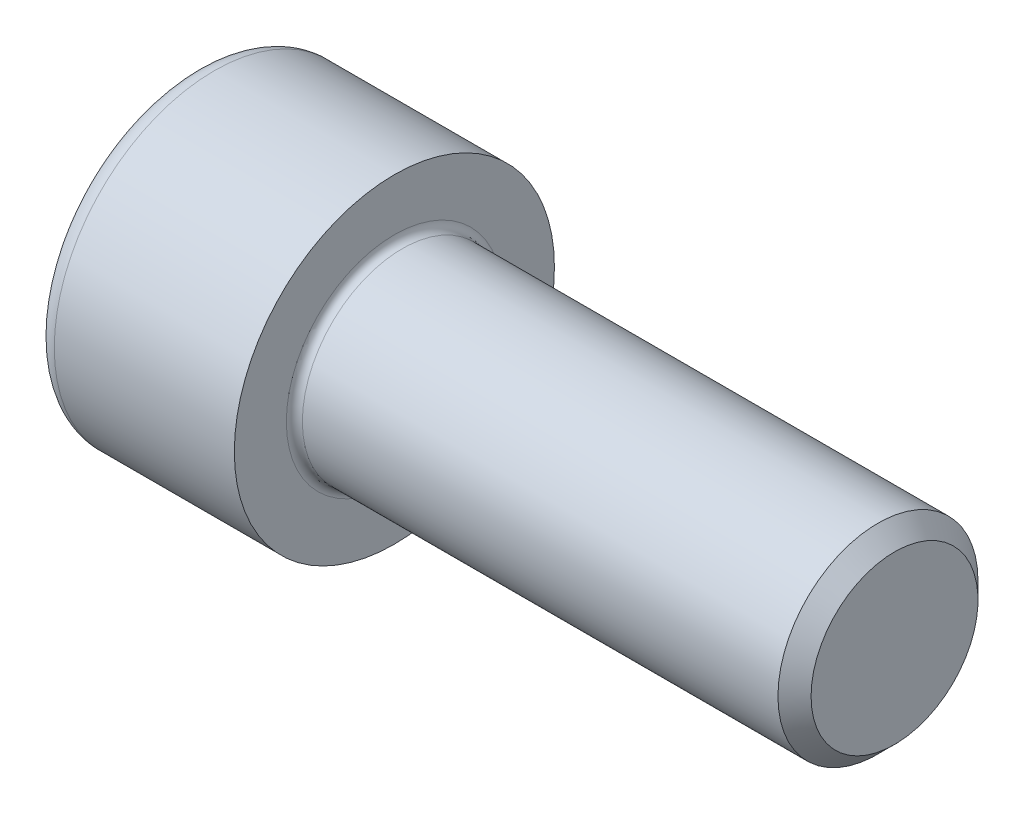
ISO-10303-21;
HEADER;
FILE_DESCRIPTION(('STEP AP214'),'2;1');
FILE_NAME('part.step','',(''),(''),'','','');
FILE_SCHEMA(('AUTOMOTIVE_DESIGN { 1 0 10303 214 1 1 1 1 }'));
ENDSEC;
DATA;
#1=APPLICATION_CONTEXT('core data for automotive mechanical design processes');
#2=APPLICATION_PROTOCOL_DEFINITION('international standard','automotive_design',2000,#1);
#3=PRODUCT_CONTEXT('',#1,'mechanical');
#4=PRODUCT('Part','Part','',(#3));
#5=PRODUCT_RELATED_PRODUCT_CATEGORY('part','',(#4));
#6=PRODUCT_DEFINITION_FORMATION('','',#4);
#7=PRODUCT_DEFINITION_CONTEXT('part definition',#1,'design');
#8=PRODUCT_DEFINITION('design','',#6,#7);
#9=PRODUCT_DEFINITION_SHAPE('','',#8);
#10=(LENGTH_UNIT() NAMED_UNIT(*) SI_UNIT(.MILLI.,.METRE.));
#11=(NAMED_UNIT(*) PLANE_ANGLE_UNIT() SI_UNIT($,.RADIAN.));
#12=(NAMED_UNIT(*) SI_UNIT($,.STERADIAN.) SOLID_ANGLE_UNIT());
#13=UNCERTAINTY_MEASURE_WITH_UNIT(LENGTH_MEASURE(1.E-05),#10,'distance_accuracy_value','');
#14=(GEOMETRIC_REPRESENTATION_CONTEXT(3) GLOBAL_UNCERTAINTY_ASSIGNED_CONTEXT((#13)) GLOBAL_UNIT_ASSIGNED_CONTEXT((#10,
#11,#12)) REPRESENTATION_CONTEXT('',''));
#15=CARTESIAN_POINT('',(0.,0.,0.));
#16=DIRECTION('',(0.,0.,1.));
#17=DIRECTION('',(1.,0.,0.));
#18=AXIS2_PLACEMENT_3D('',#15,#16,#17);
#19=CARTESIAN_POINT('',(0.,0.,0.));
#20=DIRECTION('',(-1.,0.,0.));
#21=DIRECTION('',(0.,0.,1.));
#22=AXIS2_PLACEMENT_3D('',#19,#20,#21);
#23=PLANE('',#22);
#24=DIRECTION('',(0.,-0.499999999999999,0.866025403784439));
#25=VECTOR('',#24,1.);
#26=CARTESIAN_POINT('',(0.,4.63323591024674,0.));
#27=LINE('',#26,#25);
#28=CARTESIAN_POINT('',(0.,4.63323591024674,0.));
#29=VERTEX_POINT('',#28);
#30=CARTESIAN_POINT('',(0.,2.31661795512337,4.0125));
#31=VERTEX_POINT('',#30);
#32=EDGE_CURVE('E263',#29,#31,#27,.T.);
#33=ORIENTED_EDGE('',*,*,#32,.T.);
#34=DIRECTION('',(0.,1.,0.));
#35=VECTOR('',#34,1.);
#36=CARTESIAN_POINT('',(0.,-2.31661795512338,4.01250000000001));
#37=LINE('',#36,#35);
#38=CARTESIAN_POINT('',(0.,-2.31661795512338,4.01250000000001));
#39=VERTEX_POINT('',#38);
#40=EDGE_CURVE('E135',#39,#31,#37,.T.);
#41=ORIENTED_EDGE('',*,*,#40,.F.);
#42=DIRECTION('',(0.,-0.500000000000001,-0.866025403784438));
#43=VECTOR('',#42,1.);
#44=CARTESIAN_POINT('',(0.,-2.31661795512338,4.01250000000001));
#45=LINE('',#44,#43);
#46=CARTESIAN_POINT('',(0.,-4.63323591024675,0.));
#47=VERTEX_POINT('',#46);
#48=EDGE_CURVE('E266',#39,#47,#45,.T.);
#49=ORIENTED_EDGE('',*,*,#48,.T.);
#50=DIRECTION('',(0.,0.499999999999998,-0.86602540378444));
#51=VECTOR('',#50,1.);
#52=CARTESIAN_POINT('',(0.,-4.63323591024675,0.));
#53=LINE('',#52,#51);
#54=CARTESIAN_POINT('',(0.,-2.31661795512339,-4.01249999999999));
#55=VERTEX_POINT('',#54);
#56=EDGE_CURVE('E269',#47,#55,#53,.T.);
#57=ORIENTED_EDGE('',*,*,#56,.T.);
#58=DIRECTION('',(0.,-1.,0.));
#59=VECTOR('',#58,1.);
#60=CARTESIAN_POINT('',(0.,2.31661795512336,-4.0125));
#61=LINE('',#60,#59);
#62=CARTESIAN_POINT('',(0.,2.31661795512336,-4.0125));
#63=VERTEX_POINT('',#62);
#64=EDGE_CURVE('E272',#63,#55,#61,.T.);
#65=ORIENTED_EDGE('',*,*,#64,.F.);
#66=DIRECTION('',(0.,-0.500000000000001,-0.866025403784438));
#67=VECTOR('',#66,1.);
#68=CARTESIAN_POINT('',(0.,4.63323591024674,0.));
#69=LINE('',#68,#67);
#70=EDGE_CURVE('E130',#29,#63,#69,.T.);
#71=ORIENTED_EDGE('',*,*,#70,.F.);
#72=EDGE_LOOP('',(#33,#41,#49,#57,#65,#71));
#73=FACE_BOUND('',#72,.T.);
#74=CARTESIAN_POINT('',(0.,0.,0.));
#75=DIRECTION('',(-1.,0.,0.));
#76=DIRECTION('',(0.,0.,1.));
#77=AXIS2_PLACEMENT_3D('',#74,#75,#76);
#78=CIRCLE('',#77,7.);
#79=CARTESIAN_POINT('',(0.,0.,7.));
#80=VERTEX_POINT('',#79);
#81=EDGE_CURVE('E47',#80,#80,#78,.T.);
#82=ORIENTED_EDGE('',*,*,#81,.T.);
#83=EDGE_LOOP('',(#82));
#84=FACE_BOUND('',#83,.T.);
#85=ADVANCED_FACE('F39',(#73,#84),#23,.T.);
#86=CARTESIAN_POINT('',(-31.75,0.,0.));
#87=DIRECTION('',(-1.,0.,0.));
#88=DIRECTION('',(0.,0.,1.));
#89=AXIS2_PLACEMENT_3D('',#86,#87,#88);
#90=CYLINDRICAL_SURFACE('',#89,8.);
#91=CARTESIAN_POINT('',(1.,0.,0.));
#92=DIRECTION('',(-1.,0.,0.));
#93=DIRECTION('',(0.,0.,1.));
#94=AXIS2_PLACEMENT_3D('',#91,#92,#93);
#95=CIRCLE('',#94,8.);
#96=CARTESIAN_POINT('',(1.,0.,8.));
#97=VERTEX_POINT('',#96);
#98=EDGE_CURVE('E11',#97,#97,#95,.F.);
#99=ORIENTED_EDGE('',*,*,#98,.T.);
#100=EDGE_LOOP('',(#99));
#101=FACE_BOUND('',#100,.T.);
#102=CARTESIAN_POINT('',(10.,0.,0.));
#103=DIRECTION('',(-1.,0.,0.));
#104=DIRECTION('',(0.,0.,1.));
#105=AXIS2_PLACEMENT_3D('',#102,#103,#104);
#106=CIRCLE('',#105,8.);
#107=CARTESIAN_POINT('',(10.,0.,8.));
#108=VERTEX_POINT('',#107);
#109=EDGE_CURVE('E153',#108,#108,#106,.T.);
#110=ORIENTED_EDGE('',*,*,#109,.T.);
#111=EDGE_LOOP('',(#110));
#112=FACE_BOUND('',#111,.T.);
#113=ADVANCED_FACE('F177',(#101,#112),#90,.T.);
#114=CARTESIAN_POINT('',(10.,8.,0.));
#115=DIRECTION('',(1.,0.,0.));
#116=DIRECTION('',(0.,0.,-1.));
#117=AXIS2_PLACEMENT_3D('',#114,#115,#116);
#118=PLANE('',#117);
#119=CARTESIAN_POINT('',(10.,0.,0.));
#120=DIRECTION('',(1.,0.,0.));
#121=DIRECTION('',(0.,0.,-1.));
#122=AXIS2_PLACEMENT_3D('',#119,#120,#121);
#123=CIRCLE('',#122,5.4);
#124=CARTESIAN_POINT('',(10.,0.,-5.4));
#125=VERTEX_POINT('',#124);
#126=EDGE_CURVE('E156',#125,#125,#123,.F.);
#127=ORIENTED_EDGE('',*,*,#126,.T.);
#128=EDGE_LOOP('',(#127));
#129=FACE_BOUND('',#128,.T.);
#130=ORIENTED_EDGE('',*,*,#109,.F.);
#131=EDGE_LOOP('',(#130));
#132=FACE_BOUND('',#131,.T.);
#133=ADVANCED_FACE('F183',(#129,#132),#118,.T.);
#134=CARTESIAN_POINT('',(-31.75,0.,0.));
#135=DIRECTION('',(-1.,0.,0.));
#136=DIRECTION('',(0.,0.,1.));
#137=AXIS2_PLACEMENT_3D('',#134,#135,#136);
#138=CYLINDRICAL_SURFACE('',#137,5.);
#139=CARTESIAN_POINT('',(10.4,0.,0.));
#140=DIRECTION('',(1.,0.,0.));
#141=DIRECTION('',(0.,0.,-1.));
#142=AXIS2_PLACEMENT_3D('',#139,#140,#141);
#143=CIRCLE('',#142,5.);
#144=CARTESIAN_POINT('',(10.4,0.,-5.));
#145=VERTEX_POINT('',#144);
#146=EDGE_CURVE('E159',#145,#145,#143,.T.);
#147=ORIENTED_EDGE('',*,*,#146,.T.);
#148=EDGE_LOOP('',(#147));
#149=FACE_BOUND('',#148,.T.);
#150=CARTESIAN_POINT('',(34.172,0.,0.));
#151=DIRECTION('',(-1.,0.,0.));
#152=DIRECTION('',(0.,0.,1.));
#153=AXIS2_PLACEMENT_3D('',#150,#151,#152);
#154=CIRCLE('',#153,5.);
#155=CARTESIAN_POINT('',(34.172,0.,5.));
#156=VERTEX_POINT('',#155);
#157=EDGE_CURVE('E150',#156,#156,#154,.T.);
#158=ORIENTED_EDGE('',*,*,#157,.T.);
#159=EDGE_LOOP('',(#158));
#160=FACE_BOUND('',#159,.T.);
#161=ADVANCED_FACE('F189',(#149,#160),#138,.T.);
#162=CARTESIAN_POINT('',(35.,0.,0.));
#163=DIRECTION('',(-1.,0.,0.));
#164=DIRECTION('',(0.,0.,1.));
#165=AXIS2_PLACEMENT_3D('',#162,#163,#164);
#166=CONICAL_SURFACE('',#165,4.172,0.78539816339745);
#167=ORIENTED_EDGE('',*,*,#157,.F.);
#168=EDGE_LOOP('',(#167));
#169=FACE_BOUND('',#168,.T.);
#170=CARTESIAN_POINT('',(35.,0.,0.));
#171=DIRECTION('',(-1.,0.,0.));
#172=DIRECTION('',(0.,0.,1.));
#173=AXIS2_PLACEMENT_3D('',#170,#171,#172);
#174=CIRCLE('',#173,4.172);
#175=CARTESIAN_POINT('',(35.,0.,4.172));
#176=VERTEX_POINT('',#175);
#177=EDGE_CURVE('E146',#176,#176,#174,.T.);
#178=ORIENTED_EDGE('',*,*,#177,.T.);
#179=EDGE_LOOP('',(#178));
#180=FACE_BOUND('',#179,.T.);
#181=ADVANCED_FACE('F193',(#169,#180),#166,.T.);
#182=CARTESIAN_POINT('',(35.,4.172,0.));
#183=DIRECTION('',(1.,0.,0.));
#184=DIRECTION('',(0.,0.,-1.));
#185=AXIS2_PLACEMENT_3D('',#182,#183,#184);
#186=PLANE('',#185);
#187=ORIENTED_EDGE('',*,*,#177,.F.);
#188=EDGE_LOOP('',(#187));
#189=FACE_BOUND('',#188,.T.);
#190=ADVANCED_FACE('F173',(#189),#186,.T.);
#191=CARTESIAN_POINT('',(10.4,0.,0.));
#192=DIRECTION('',(1.,0.,0.));
#193=DIRECTION('',(0.,0.,-1.));
#194=AXIS2_PLACEMENT_3D('',#191,#192,#193);
#195=TOROIDAL_SURFACE('',#194,5.4,0.4);
#196=ORIENTED_EDGE('',*,*,#146,.F.);
#197=EDGE_LOOP('',(#196));
#198=FACE_BOUND('',#197,.T.);
#199=ORIENTED_EDGE('',*,*,#126,.F.);
#200=EDGE_LOOP('',(#199));
#201=FACE_BOUND('',#200,.T.);
#202=ADVANCED_FACE('F166',(#198,#201),#195,.F.);
#203=CARTESIAN_POINT('',(1.,0.,0.));
#204=DIRECTION('',(-1.,0.,0.));
#205=DIRECTION('',(0.,0.,1.));
#206=AXIS2_PLACEMENT_3D('',#203,#204,#205);
#207=TOROIDAL_SURFACE('',#206,7.,1.);
#208=ORIENTED_EDGE('',*,*,#98,.F.);
#209=EDGE_LOOP('',(#208));
#210=FACE_BOUND('',#209,.T.);
#211=ORIENTED_EDGE('',*,*,#81,.F.);
#212=EDGE_LOOP('',(#211));
#213=FACE_BOUND('',#212,.T.);
#214=ADVANCED_FACE('F41',(#210,#213),#207,.T.);
#215=CARTESIAN_POINT('',(5.,4.63323591024674,0.));
#216=DIRECTION('',(0.,-0.866025403784439,-0.499999999999999));
#217=DIRECTION('',(0.,0.499999999999999,-0.866025403784439));
#218=AXIS2_PLACEMENT_3D('',#215,#216,#217);
#219=PLANE('',#218);
#220=ORIENTED_EDGE('',*,*,#32,.F.);
#221=DIRECTION('',(-1.,0.,0.));
#222=VECTOR('',#221,1.);
#223=CARTESIAN_POINT('',(5.,4.63323591024674,0.));
#224=LINE('',#223,#222);
#225=CARTESIAN_POINT('',(5.,4.63323591024674,0.));
#226=VERTEX_POINT('',#225);
#227=EDGE_CURVE('E253',#226,#29,#224,.T.);
#228=ORIENTED_EDGE('',*,*,#227,.F.);
#229=DIRECTION('',(0.,-0.499999999999999,0.866025403784439));
#230=VECTOR('',#229,1.);
#231=CARTESIAN_POINT('',(5.,4.63323591024674,0.));
#232=LINE('',#231,#230);
#233=CARTESIAN_POINT('',(5.,3.47492693268506,2.00624999999999));
#234=VERTEX_POINT('',#233);
#235=EDGE_CURVE('E122',#226,#234,#232,.T.);
#236=ORIENTED_EDGE('',*,*,#235,.T.);
#237=CARTESIAN_POINT('',(5.,2.31661795512337,4.0125));
#238=VERTEX_POINT('',#237);
#239=EDGE_CURVE('E113',#234,#238,#232,.T.);
#240=ORIENTED_EDGE('',*,*,#239,.T.);
#241=DIRECTION('',(-1.,0.,0.));
#242=VECTOR('',#241,1.);
#243=CARTESIAN_POINT('',(5.,2.31661795512337,4.0125));
#244=LINE('',#243,#242);
#245=EDGE_CURVE('E127',#238,#31,#244,.T.);
#246=ORIENTED_EDGE('',*,*,#245,.T.);
#247=EDGE_LOOP('',(#220,#228,#236,#240,#246));
#248=FACE_BOUND('',#247,.T.);
#249=ADVANCED_FACE('F126',(#248),#219,.T.);
#250=CARTESIAN_POINT('',(5.,-2.31661795512338,4.01250000000001));
#251=DIRECTION('',(0.,0.,1.));
#252=DIRECTION('',(0.,-1.,0.));
#253=AXIS2_PLACEMENT_3D('',#250,#251,#252);
#254=PLANE('',#253);
#255=ORIENTED_EDGE('',*,*,#40,.T.);
#256=ORIENTED_EDGE('',*,*,#245,.F.);
#257=DIRECTION('',(0.,1.,0.));
#258=VECTOR('',#257,1.);
#259=CARTESIAN_POINT('',(5.,-2.31661795512338,4.01250000000001));
#260=LINE('',#259,#258);
#261=CARTESIAN_POINT('',(5.,0.,4.0125));
#262=VERTEX_POINT('',#261);
#263=EDGE_CURVE('E110',#262,#238,#260,.T.);
#264=ORIENTED_EDGE('',*,*,#263,.F.);
#265=CARTESIAN_POINT('',(5.,-2.31661795512338,4.01250000000001));
#266=VERTEX_POINT('',#265);
#267=EDGE_CURVE('E121',#266,#262,#260,.T.);
#268=ORIENTED_EDGE('',*,*,#267,.F.);
#269=DIRECTION('',(-1.,0.,0.));
#270=VECTOR('',#269,1.);
#271=CARTESIAN_POINT('',(5.,-2.31661795512338,4.01250000000001));
#272=LINE('',#271,#270);
#273=EDGE_CURVE('E137',#266,#39,#272,.T.);
#274=ORIENTED_EDGE('',*,*,#273,.T.);
#275=EDGE_LOOP('',(#255,#256,#264,#268,#274));
#276=FACE_BOUND('',#275,.T.);
#277=ADVANCED_FACE('F132',(#276),#254,.F.);
#278=CARTESIAN_POINT('',(5.,-2.31661795512338,4.01250000000001));
#279=DIRECTION('',(0.,0.866025403784438,-0.500000000000001));
#280=DIRECTION('',(0.,0.500000000000001,0.866025403784438));
#281=AXIS2_PLACEMENT_3D('',#278,#279,#280);
#282=PLANE('',#281);
#283=ORIENTED_EDGE('',*,*,#48,.F.);
#284=ORIENTED_EDGE('',*,*,#273,.F.);
#285=DIRECTION('',(0.,-0.500000000000001,-0.866025403784438));
#286=VECTOR('',#285,1.);
#287=CARTESIAN_POINT('',(5.,-2.31661795512338,4.01250000000001));
#288=LINE('',#287,#286);
#289=CARTESIAN_POINT('',(5.,-3.47492693268506,2.00625000000001));
#290=VERTEX_POINT('',#289);
#291=EDGE_CURVE('E292',#266,#290,#288,.T.);
#292=ORIENTED_EDGE('',*,*,#291,.T.);
#293=CARTESIAN_POINT('',(5.,-4.63323591024675,0.));
#294=VERTEX_POINT('',#293);
#295=EDGE_CURVE('E281',#290,#294,#288,.T.);
#296=ORIENTED_EDGE('',*,*,#295,.T.);
#297=DIRECTION('',(-1.,0.,0.));
#298=VECTOR('',#297,1.);
#299=CARTESIAN_POINT('',(5.,-4.63323591024675,0.));
#300=LINE('',#299,#298);
#301=EDGE_CURVE('E142',#294,#47,#300,.T.);
#302=ORIENTED_EDGE('',*,*,#301,.T.);
#303=EDGE_LOOP('',(#283,#284,#292,#296,#302));
#304=FACE_BOUND('',#303,.T.);
#305=ADVANCED_FACE('F207',(#304),#282,.T.);
#306=CARTESIAN_POINT('',(5.,-4.63323591024675,0.));
#307=DIRECTION('',(0.,0.86602540378444,0.499999999999998));
#308=DIRECTION('',(0.,-0.499999999999998,0.86602540378444));
#309=AXIS2_PLACEMENT_3D('',#306,#307,#308);
#310=PLANE('',#309);
#311=ORIENTED_EDGE('',*,*,#56,.F.);
#312=ORIENTED_EDGE('',*,*,#301,.F.);
#313=DIRECTION('',(0.,0.499999999999998,-0.86602540378444));
#314=VECTOR('',#313,1.);
#315=CARTESIAN_POINT('',(5.,-4.63323591024675,0.));
#316=LINE('',#315,#314);
#317=CARTESIAN_POINT('',(5.,-3.47492693268507,-2.00625));
#318=VERTEX_POINT('',#317);
#319=EDGE_CURVE('E259',#294,#318,#316,.T.);
#320=ORIENTED_EDGE('',*,*,#319,.T.);
#321=CARTESIAN_POINT('',(5.,-2.31661795512339,-4.01249999999999));
#322=VERTEX_POINT('',#321);
#323=EDGE_CURVE('E291',#318,#322,#316,.T.);
#324=ORIENTED_EDGE('',*,*,#323,.T.);
#325=DIRECTION('',(-1.,0.,0.));
#326=VECTOR('',#325,1.);
#327=CARTESIAN_POINT('',(5.,-2.31661795512339,-4.01249999999999));
#328=LINE('',#327,#326);
#329=EDGE_CURVE('E252',#322,#55,#328,.T.);
#330=ORIENTED_EDGE('',*,*,#329,.T.);
#331=EDGE_LOOP('',(#311,#312,#320,#324,#330));
#332=FACE_BOUND('',#331,.T.);
#333=ADVANCED_FACE('F210',(#332),#310,.T.);
#334=CARTESIAN_POINT('',(5.,2.31661795512336,-4.0125));
#335=DIRECTION('',(0.,0.,-1.));
#336=DIRECTION('',(0.,1.,0.));
#337=AXIS2_PLACEMENT_3D('',#334,#335,#336);
#338=PLANE('',#337);
#339=ORIENTED_EDGE('',*,*,#64,.T.);
#340=ORIENTED_EDGE('',*,*,#329,.F.);
#341=DIRECTION('',(0.,-1.,0.));
#342=VECTOR('',#341,1.);
#343=CARTESIAN_POINT('',(5.,2.31661795512336,-4.0125));
#344=LINE('',#343,#342);
#345=CARTESIAN_POINT('',(5.,0.,-4.0125));
#346=VERTEX_POINT('',#345);
#347=EDGE_CURVE('E256',#346,#322,#344,.T.);
#348=ORIENTED_EDGE('',*,*,#347,.F.);
#349=CARTESIAN_POINT('',(5.,2.31661795512336,-4.0125));
#350=VERTEX_POINT('',#349);
#351=EDGE_CURVE('E54',#350,#346,#344,.T.);
#352=ORIENTED_EDGE('',*,*,#351,.F.);
#353=DIRECTION('',(-1.,0.,0.));
#354=VECTOR('',#353,1.);
#355=CARTESIAN_POINT('',(5.,2.31661795512336,-4.0125));
#356=LINE('',#355,#354);
#357=EDGE_CURVE('E249',#350,#63,#356,.T.);
#358=ORIENTED_EDGE('',*,*,#357,.T.);
#359=EDGE_LOOP('',(#339,#340,#348,#352,#358));
#360=FACE_BOUND('',#359,.T.);
#361=ADVANCED_FACE('F214',(#360),#338,.F.);
#362=CARTESIAN_POINT('',(5.,4.63323591024674,0.));
#363=DIRECTION('',(0.,0.866025403784438,-0.500000000000001));
#364=DIRECTION('',(0.,0.500000000000001,0.866025403784438));
#365=AXIS2_PLACEMENT_3D('',#362,#363,#364);
#366=PLANE('',#365);
#367=ORIENTED_EDGE('',*,*,#70,.T.);
#368=ORIENTED_EDGE('',*,*,#357,.F.);
#369=DIRECTION('',(0.,-0.500000000000001,-0.866025403784438));
#370=VECTOR('',#369,1.);
#371=CARTESIAN_POINT('',(5.,4.63323591024674,0.));
#372=LINE('',#371,#370);
#373=CARTESIAN_POINT('',(5.,3.47492693268505,-2.00625));
#374=VERTEX_POINT('',#373);
#375=EDGE_CURVE('E239',#374,#350,#372,.T.);
#376=ORIENTED_EDGE('',*,*,#375,.F.);
#377=EDGE_CURVE('E245',#226,#374,#372,.T.);
#378=ORIENTED_EDGE('',*,*,#377,.F.);
#379=ORIENTED_EDGE('',*,*,#227,.T.);
#380=EDGE_LOOP('',(#367,#368,#376,#378,#379));
#381=FACE_BOUND('',#380,.T.);
#382=ADVANCED_FACE('F218',(#381),#366,.F.);
#383=CARTESIAN_POINT('',(5.,6.9498538653701,-4.01250000000001));
#384=DIRECTION('',(1.,0.,0.));
#385=DIRECTION('',(0.,0.,-1.));
#386=AXIS2_PLACEMENT_3D('',#383,#384,#385);
#387=PLANE('',#386);
#388=ORIENTED_EDGE('',*,*,#347,.T.);
#389=ORIENTED_EDGE('',*,*,#323,.F.);
#390=CARTESIAN_POINT('',(5.,0.,0.));
#391=DIRECTION('',(-1.,0.,0.));
#392=DIRECTION('',(0.,0.,1.));
#393=AXIS2_PLACEMENT_3D('',#390,#391,#392);
#394=CIRCLE('',#393,4.0125);
#395=EDGE_CURVE('E287',#346,#318,#394,.T.);
#396=ORIENTED_EDGE('',*,*,#395,.F.);
#397=EDGE_LOOP('',(#388,#389,#396));
#398=FACE_BOUND('',#397,.T.);
#399=ADVANCED_FACE('F222',(#398),#387,.F.);
#400=ORIENTED_EDGE('',*,*,#319,.F.);
#401=ORIENTED_EDGE('',*,*,#295,.F.);
#402=EDGE_CURVE('E140',#318,#290,#394,.T.);
#403=ORIENTED_EDGE('',*,*,#402,.F.);
#404=EDGE_LOOP('',(#400,#401,#403));
#405=FACE_BOUND('',#404,.T.);
#406=ADVANCED_FACE('F225',(#405),#387,.F.);
#407=ORIENTED_EDGE('',*,*,#291,.F.);
#408=ORIENTED_EDGE('',*,*,#267,.T.);
#409=EDGE_CURVE('E136',#290,#262,#394,.T.);
#410=ORIENTED_EDGE('',*,*,#409,.F.);
#411=EDGE_LOOP('',(#407,#408,#410));
#412=FACE_BOUND('',#411,.T.);
#413=ADVANCED_FACE('F230',(#412),#387,.F.);
#414=ORIENTED_EDGE('',*,*,#263,.T.);
#415=ORIENTED_EDGE('',*,*,#239,.F.);
#416=EDGE_CURVE('E116',#262,#234,#394,.T.);
#417=ORIENTED_EDGE('',*,*,#416,.F.);
#418=EDGE_LOOP('',(#414,#415,#417));
#419=FACE_BOUND('',#418,.T.);
#420=ADVANCED_FACE('F112',(#419),#387,.F.);
#421=ORIENTED_EDGE('',*,*,#235,.F.);
#422=ORIENTED_EDGE('',*,*,#377,.T.);
#423=EDGE_CURVE('E147',#234,#374,#394,.T.);
#424=ORIENTED_EDGE('',*,*,#423,.F.);
#425=EDGE_LOOP('',(#421,#422,#424));
#426=FACE_BOUND('',#425,.T.);
#427=ADVANCED_FACE('F233',(#426),#387,.F.);
#428=ORIENTED_EDGE('',*,*,#375,.T.);
#429=ORIENTED_EDGE('',*,*,#351,.T.);
#430=EDGE_CURVE('E242',#374,#346,#394,.T.);
#431=ORIENTED_EDGE('',*,*,#430,.F.);
#432=EDGE_LOOP('',(#428,#429,#431));
#433=FACE_BOUND('',#432,.T.);
#434=ADVANCED_FACE('F203',(#433),#387,.F.);
#435=CARTESIAN_POINT('',(5.,0.,0.));
#436=DIRECTION('',(-1.,0.,0.));
#437=DIRECTION('',(0.,0.,1.));
#438=AXIS2_PLACEMENT_3D('',#435,#436,#437);
#439=CONICAL_SURFACE('',#438,4.0125,1.04719755119659);
#440=CARTESIAN_POINT('',(7.31661795512339,0.,0.));
#441=VERTEX_POINT('',#440);
#442=VERTEX_LOOP('',#441);
#443=FACE_BOUND('',#442,.T.);
#444=ORIENTED_EDGE('',*,*,#416,.T.);
#445=ORIENTED_EDGE('',*,*,#423,.T.);
#446=ORIENTED_EDGE('',*,*,#430,.T.);
#447=ORIENTED_EDGE('',*,*,#395,.T.);
#448=ORIENTED_EDGE('',*,*,#402,.T.);
#449=ORIENTED_EDGE('',*,*,#409,.T.);
#450=EDGE_LOOP('',(#444,#445,#446,#447,#448,#449));
#451=FACE_BOUND('',#450,.T.);
#452=ADVANCED_FACE('F201',(#443,#451),#439,.F.);
#453=CLOSED_SHELL('',(#85,#113,#133,#161,#181,#190,#202,#214,#249,#277,#305,#333,#361,#382,#399,
#406,#413,#420,#427,#434,#452));
#454=MANIFOLD_SOLID_BREP('B2',#453);
#455=ADVANCED_BREP_SHAPE_REPRESENTATION('',(#18,#454),#14);
#456=SHAPE_DEFINITION_REPRESENTATION(#9,#455);
ENDSEC;
END-ISO-10303-21;
